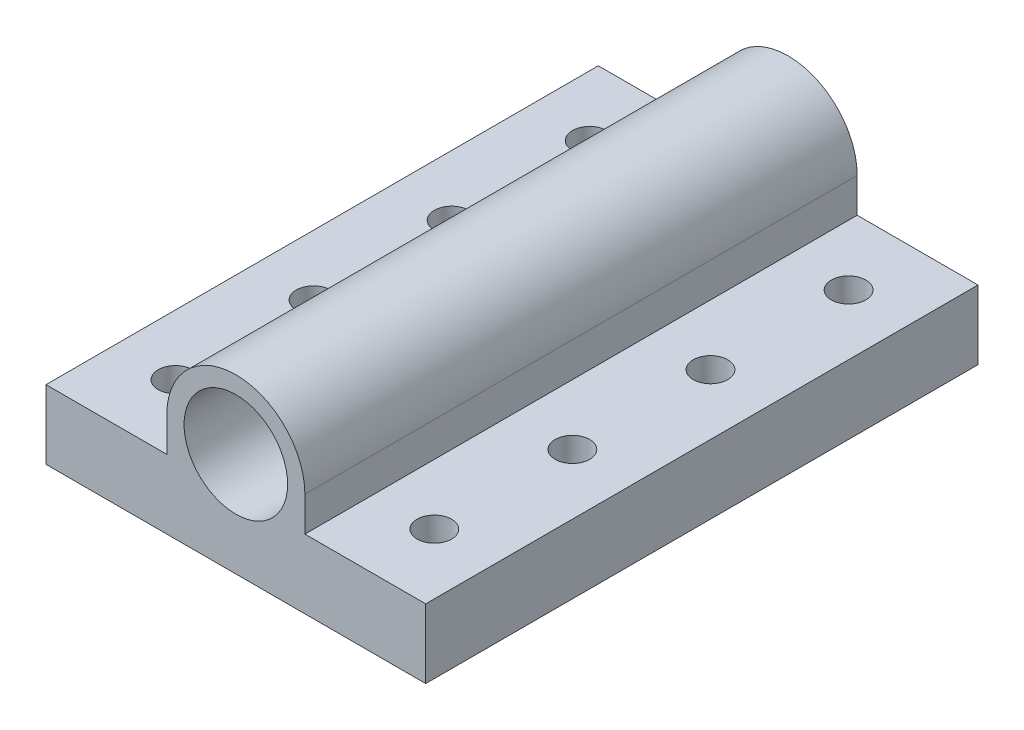
ISO-10303-21;
HEADER;
FILE_DESCRIPTION(('STEP AP214'),'2;1');
FILE_NAME('part.step','',(''),(''),'','','');
FILE_SCHEMA(('AUTOMOTIVE_DESIGN { 1 0 10303 214 1 1 1 1 }'));
ENDSEC;
DATA;
#1=APPLICATION_CONTEXT('core data for automotive mechanical design processes');
#2=APPLICATION_PROTOCOL_DEFINITION('international standard','automotive_design',2000,#1);
#3=PRODUCT_CONTEXT('',#1,'mechanical');
#4=PRODUCT('Part','Part','',(#3));
#5=PRODUCT_RELATED_PRODUCT_CATEGORY('part','',(#4));
#6=PRODUCT_DEFINITION_FORMATION('','',#4);
#7=PRODUCT_DEFINITION_CONTEXT('part definition',#1,'design');
#8=PRODUCT_DEFINITION('design','',#6,#7);
#9=PRODUCT_DEFINITION_SHAPE('','',#8);
#10=(LENGTH_UNIT() NAMED_UNIT(*) SI_UNIT(.MILLI.,.METRE.));
#11=(NAMED_UNIT(*) PLANE_ANGLE_UNIT() SI_UNIT($,.RADIAN.));
#12=(NAMED_UNIT(*) SI_UNIT($,.STERADIAN.) SOLID_ANGLE_UNIT());
#13=UNCERTAINTY_MEASURE_WITH_UNIT(LENGTH_MEASURE(1.E-05),#10,'distance_accuracy_value','');
#14=(GEOMETRIC_REPRESENTATION_CONTEXT(3) GLOBAL_UNCERTAINTY_ASSIGNED_CONTEXT((#13)) GLOBAL_UNIT_ASSIGNED_CONTEXT((#10,
#11,#12)) REPRESENTATION_CONTEXT('',''));
#15=CARTESIAN_POINT('',(0.,0.,0.));
#16=DIRECTION('',(0.,0.,1.));
#17=DIRECTION('',(1.,0.,0.));
#18=AXIS2_PLACEMENT_3D('',#15,#16,#17);
#19=CARTESIAN_POINT('',(-27.5,5.00000000000001,80.));
#20=DIRECTION('',(0.,0.,-1.));
#21=DIRECTION('',(-1.,0.,0.));
#22=AXIS2_PLACEMENT_3D('',#19,#20,#21);
#23=PLANE('',#22);
#24=DIRECTION('',(0.,1.,0.));
#25=VECTOR('',#24,1.);
#26=CARTESIAN_POINT('',(0.,0.,80.));
#27=LINE('',#26,#25);
#28=CARTESIAN_POINT('',(0.,-9.99999999999998,80.));
#29=VERTEX_POINT('',#28);
#30=CARTESIAN_POINT('',(0.,0.,80.));
#31=VERTEX_POINT('',#30);
#32=EDGE_CURVE('E147',#29,#31,#27,.T.);
#33=ORIENTED_EDGE('',*,*,#32,.T.);
#34=DIRECTION('',(-1.,0.,0.));
#35=VECTOR('',#34,1.);
#36=CARTESIAN_POINT('',(0.,0.,80.));
#37=LINE('',#36,#35);
#38=CARTESIAN_POINT('',(-17.5,0.,80.));
#39=VERTEX_POINT('',#38);
#40=EDGE_CURVE('E95',#31,#39,#37,.T.);
#41=ORIENTED_EDGE('',*,*,#40,.T.);
#42=DIRECTION('',(0.,1.,0.));
#43=VECTOR('',#42,1.);
#44=CARTESIAN_POINT('',(-17.5,0.,80.));
#45=LINE('',#44,#43);
#46=CARTESIAN_POINT('',(-17.5,5.00000000000001,80.));
#47=VERTEX_POINT('',#46);
#48=EDGE_CURVE('E195',#39,#47,#45,.T.);
#49=ORIENTED_EDGE('',*,*,#48,.T.);
#50=CARTESIAN_POINT('',(-27.5,5.00000000000001,80.));
#51=DIRECTION('',(0.,0.,1.));
#52=DIRECTION('',(-1.,0.,0.));
#53=AXIS2_PLACEMENT_3D('',#50,#51,#52);
#54=CIRCLE('',#53,10.);
#55=CARTESIAN_POINT('',(-37.5,5.00000000000001,80.));
#56=VERTEX_POINT('',#55);
#57=EDGE_CURVE('E197',#47,#56,#54,.T.);
#58=ORIENTED_EDGE('',*,*,#57,.T.);
#59=DIRECTION('',(0.,-1.,0.));
#60=VECTOR('',#59,1.);
#61=CARTESIAN_POINT('',(-37.5,0.,80.));
#62=LINE('',#61,#60);
#63=CARTESIAN_POINT('',(-37.5,0.,80.));
#64=VERTEX_POINT('',#63);
#65=EDGE_CURVE('E114',#56,#64,#62,.T.);
#66=ORIENTED_EDGE('',*,*,#65,.T.);
#67=DIRECTION('',(-1.,0.,0.));
#68=VECTOR('',#67,1.);
#69=CARTESIAN_POINT('',(-37.5,0.,80.));
#70=LINE('',#69,#68);
#71=CARTESIAN_POINT('',(-55.,0.,80.));
#72=VERTEX_POINT('',#71);
#73=EDGE_CURVE('E108',#64,#72,#70,.T.);
#74=ORIENTED_EDGE('',*,*,#73,.T.);
#75=DIRECTION('',(0.,-1.,0.));
#76=VECTOR('',#75,1.);
#77=CARTESIAN_POINT('',(-55.,0.,80.));
#78=LINE('',#77,#76);
#79=CARTESIAN_POINT('',(-55.,-10.,80.));
#80=VERTEX_POINT('',#79);
#81=EDGE_CURVE('E112',#72,#80,#78,.T.);
#82=ORIENTED_EDGE('',*,*,#81,.T.);
#83=DIRECTION('',(1.,0.,0.));
#84=VECTOR('',#83,1.);
#85=CARTESIAN_POINT('',(0.,-9.99999999999998,80.));
#86=LINE('',#85,#84);
#87=EDGE_CURVE('E52',#80,#29,#86,.T.);
#88=ORIENTED_EDGE('',*,*,#87,.T.);
#89=EDGE_LOOP('',(#33,#41,#49,#58,#66,#74,#82,#88));
#90=FACE_BOUND('',#89,.T.);
#91=CARTESIAN_POINT('',(-27.5,5.00000000000001,80.));
#92=DIRECTION('',(0.,0.,1.));
#93=DIRECTION('',(1.,0.,0.));
#94=AXIS2_PLACEMENT_3D('',#91,#92,#93);
#95=CIRCLE('',#94,7.5);
#96=CARTESIAN_POINT('',(-20.,5.00000000000001,80.));
#97=VERTEX_POINT('',#96);
#98=EDGE_CURVE('E136',#97,#97,#95,.T.);
#99=ORIENTED_EDGE('',*,*,#98,.F.);
#100=EDGE_LOOP('',(#99));
#101=FACE_BOUND('',#100,.T.);
#102=ADVANCED_FACE('F33',(#90,#101),#23,.F.);
#103=CARTESIAN_POINT('',(-27.5,5.00000000000001,0.));
#104=DIRECTION('',(0.,0.,-1.));
#105=DIRECTION('',(-1.,0.,0.));
#106=AXIS2_PLACEMENT_3D('',#103,#104,#105);
#107=PLANE('',#106);
#108=DIRECTION('',(0.,1.,0.));
#109=VECTOR('',#108,1.);
#110=CARTESIAN_POINT('',(0.,0.,0.));
#111=LINE('',#110,#109);
#112=CARTESIAN_POINT('',(0.,-9.99999999999998,0.));
#113=VERTEX_POINT('',#112);
#114=CARTESIAN_POINT('',(0.,0.,0.));
#115=VERTEX_POINT('',#114);
#116=EDGE_CURVE('E132',#113,#115,#111,.T.);
#117=ORIENTED_EDGE('',*,*,#116,.F.);
#118=DIRECTION('',(1.,0.,0.));
#119=VECTOR('',#118,1.);
#120=CARTESIAN_POINT('',(0.,-9.99999999999998,0.));
#121=LINE('',#120,#119);
#122=CARTESIAN_POINT('',(-55.,-10.,0.));
#123=VERTEX_POINT('',#122);
#124=EDGE_CURVE('E87',#123,#113,#121,.T.);
#125=ORIENTED_EDGE('',*,*,#124,.F.);
#126=DIRECTION('',(0.,-1.,0.));
#127=VECTOR('',#126,1.);
#128=CARTESIAN_POINT('',(-55.,0.,0.));
#129=LINE('',#128,#127);
#130=CARTESIAN_POINT('',(-55.,0.,0.));
#131=VERTEX_POINT('',#130);
#132=EDGE_CURVE('E81',#131,#123,#129,.T.);
#133=ORIENTED_EDGE('',*,*,#132,.F.);
#134=DIRECTION('',(-1.,0.,0.));
#135=VECTOR('',#134,1.);
#136=CARTESIAN_POINT('',(-37.5,0.,0.));
#137=LINE('',#136,#135);
#138=CARTESIAN_POINT('',(-37.5,0.,0.));
#139=VERTEX_POINT('',#138);
#140=EDGE_CURVE('E122',#139,#131,#137,.T.);
#141=ORIENTED_EDGE('',*,*,#140,.F.);
#142=DIRECTION('',(0.,-1.,0.));
#143=VECTOR('',#142,1.);
#144=CARTESIAN_POINT('',(-37.5,0.,0.));
#145=LINE('',#144,#143);
#146=CARTESIAN_POINT('',(-37.5,5.00000000000001,0.));
#147=VERTEX_POINT('',#146);
#148=EDGE_CURVE('E142',#147,#139,#145,.T.);
#149=ORIENTED_EDGE('',*,*,#148,.F.);
#150=CARTESIAN_POINT('',(-27.5,5.00000000000001,0.));
#151=DIRECTION('',(0.,0.,1.));
#152=DIRECTION('',(-1.,0.,0.));
#153=AXIS2_PLACEMENT_3D('',#150,#151,#152);
#154=CIRCLE('',#153,10.);
#155=CARTESIAN_POINT('',(-17.5,5.00000000000001,0.));
#156=VERTEX_POINT('',#155);
#157=EDGE_CURVE('E140',#156,#147,#154,.T.);
#158=ORIENTED_EDGE('',*,*,#157,.F.);
#159=DIRECTION('',(0.,1.,0.));
#160=VECTOR('',#159,1.);
#161=CARTESIAN_POINT('',(-17.5,0.,0.));
#162=LINE('',#161,#160);
#163=CARTESIAN_POINT('',(-17.5,0.,0.));
#164=VERTEX_POINT('',#163);
#165=EDGE_CURVE('E138',#164,#156,#162,.T.);
#166=ORIENTED_EDGE('',*,*,#165,.F.);
#167=DIRECTION('',(-1.,0.,0.));
#168=VECTOR('',#167,1.);
#169=CARTESIAN_POINT('',(0.,0.,0.));
#170=LINE('',#169,#168);
#171=EDGE_CURVE('E135',#115,#164,#170,.T.);
#172=ORIENTED_EDGE('',*,*,#171,.F.);
#173=EDGE_LOOP('',(#117,#125,#133,#141,#149,#158,#166,#172));
#174=FACE_BOUND('',#173,.T.);
#175=CARTESIAN_POINT('',(-27.5,5.00000000000001,0.));
#176=DIRECTION('',(0.,0.,1.));
#177=DIRECTION('',(1.,0.,0.));
#178=AXIS2_PLACEMENT_3D('',#175,#176,#177);
#179=CIRCLE('',#178,7.5);
#180=CARTESIAN_POINT('',(-20.,5.00000000000001,0.));
#181=VERTEX_POINT('',#180);
#182=EDGE_CURVE('E182',#181,#181,#179,.T.);
#183=ORIENTED_EDGE('',*,*,#182,.T.);
#184=EDGE_LOOP('',(#183));
#185=FACE_BOUND('',#184,.T.);
#186=ADVANCED_FACE('F210',(#174,#185),#107,.T.);
#187=CARTESIAN_POINT('',(0.,0.,80.));
#188=DIRECTION('',(-1.,0.,0.));
#189=DIRECTION('',(0.,0.,1.));
#190=AXIS2_PLACEMENT_3D('',#187,#188,#189);
#191=PLANE('',#190);
#192=ORIENTED_EDGE('',*,*,#116,.T.);
#193=DIRECTION('',(0.,0.,-1.));
#194=VECTOR('',#193,1.);
#195=CARTESIAN_POINT('',(0.,0.,80.));
#196=LINE('',#195,#194);
#197=EDGE_CURVE('E11',#31,#115,#196,.T.);
#198=ORIENTED_EDGE('',*,*,#197,.F.);
#199=ORIENTED_EDGE('',*,*,#32,.F.);
#200=DIRECTION('',(0.,0.,-1.));
#201=VECTOR('',#200,1.);
#202=CARTESIAN_POINT('',(0.,-9.99999999999998,80.));
#203=LINE('',#202,#201);
#204=EDGE_CURVE('E128',#29,#113,#203,.T.);
#205=ORIENTED_EDGE('',*,*,#204,.T.);
#206=EDGE_LOOP('',(#192,#198,#199,#205));
#207=FACE_BOUND('',#206,.T.);
#208=ADVANCED_FACE('F35',(#207),#191,.F.);
#209=CARTESIAN_POINT('',(0.,0.,80.));
#210=DIRECTION('',(0.,-1.,0.));
#211=DIRECTION('',(1.,0.,0.));
#212=AXIS2_PLACEMENT_3D('',#209,#210,#211);
#213=PLANE('',#212);
#214=CARTESIAN_POINT('',(-8.75000000000001,0.,30.));
#215=DIRECTION('',(0.,1.,0.));
#216=DIRECTION('',(0.,0.,1.));
#217=AXIS2_PLACEMENT_3D('',#214,#215,#216);
#218=CIRCLE('',#217,2.5);
#219=CARTESIAN_POINT('',(-8.75000000000001,0.,32.5));
#220=VERTEX_POINT('',#219);
#221=EDGE_CURVE('E294',#220,#220,#218,.T.);
#222=ORIENTED_EDGE('',*,*,#221,.F.);
#223=EDGE_LOOP('',(#222));
#224=FACE_BOUND('',#223,.T.);
#225=CARTESIAN_POINT('',(-8.75,0.,50.));
#226=DIRECTION('',(0.,1.,0.));
#227=DIRECTION('',(0.,0.,1.));
#228=AXIS2_PLACEMENT_3D('',#225,#226,#227);
#229=CIRCLE('',#228,2.5);
#230=CARTESIAN_POINT('',(-8.75,0.,52.5));
#231=VERTEX_POINT('',#230);
#232=EDGE_CURVE('E297',#231,#231,#229,.T.);
#233=ORIENTED_EDGE('',*,*,#232,.F.);
#234=EDGE_LOOP('',(#233));
#235=FACE_BOUND('',#234,.T.);
#236=CARTESIAN_POINT('',(-8.75,0.,70.));
#237=DIRECTION('',(0.,1.,0.));
#238=DIRECTION('',(0.,0.,1.));
#239=AXIS2_PLACEMENT_3D('',#236,#237,#238);
#240=CIRCLE('',#239,2.5);
#241=CARTESIAN_POINT('',(-8.75,0.,72.5));
#242=VERTEX_POINT('',#241);
#243=EDGE_CURVE('E286',#242,#242,#240,.T.);
#244=ORIENTED_EDGE('',*,*,#243,.F.);
#245=EDGE_LOOP('',(#244));
#246=FACE_BOUND('',#245,.T.);
#247=CARTESIAN_POINT('',(-8.75000000000001,0.,10.));
#248=DIRECTION('',(0.,1.,0.));
#249=DIRECTION('',(0.,0.,1.));
#250=AXIS2_PLACEMENT_3D('',#247,#248,#249);
#251=CIRCLE('',#250,2.5);
#252=CARTESIAN_POINT('',(-8.75000000000001,0.,12.5));
#253=VERTEX_POINT('',#252);
#254=EDGE_CURVE('E163',#253,#253,#251,.T.);
#255=ORIENTED_EDGE('',*,*,#254,.F.);
#256=EDGE_LOOP('',(#255));
#257=FACE_BOUND('',#256,.T.);
#258=ORIENTED_EDGE('',*,*,#171,.T.);
#259=DIRECTION('',(0.,0.,-1.));
#260=VECTOR('',#259,1.);
#261=CARTESIAN_POINT('',(-17.5,0.,80.));
#262=LINE('',#261,#260);
#263=EDGE_CURVE('E43',#39,#164,#262,.T.);
#264=ORIENTED_EDGE('',*,*,#263,.F.);
#265=ORIENTED_EDGE('',*,*,#40,.F.);
#266=ORIENTED_EDGE('',*,*,#197,.T.);
#267=EDGE_LOOP('',(#258,#264,#265,#266));
#268=FACE_BOUND('',#267,.T.);
#269=ADVANCED_FACE('F304',(#224,#235,#246,#257,#268),#213,.F.);
#270=CARTESIAN_POINT('',(-17.5,0.,80.));
#271=DIRECTION('',(-1.,0.,0.));
#272=DIRECTION('',(0.,-1.,0.));
#273=AXIS2_PLACEMENT_3D('',#270,#271,#272);
#274=PLANE('',#273);
#275=ORIENTED_EDGE('',*,*,#165,.T.);
#276=DIRECTION('',(0.,0.,-1.));
#277=VECTOR('',#276,1.);
#278=CARTESIAN_POINT('',(-17.5,5.00000000000001,80.));
#279=LINE('',#278,#277);
#280=EDGE_CURVE('E154',#47,#156,#279,.T.);
#281=ORIENTED_EDGE('',*,*,#280,.F.);
#282=ORIENTED_EDGE('',*,*,#48,.F.);
#283=ORIENTED_EDGE('',*,*,#263,.T.);
#284=EDGE_LOOP('',(#275,#281,#282,#283));
#285=FACE_BOUND('',#284,.T.);
#286=ADVANCED_FACE('F306',(#285),#274,.F.);
#287=CARTESIAN_POINT('',(-27.5,5.00000000000001,80.));
#288=DIRECTION('',(0.,0.,-1.));
#289=DIRECTION('',(-1.,0.,0.));
#290=AXIS2_PLACEMENT_3D('',#287,#288,#289);
#291=CYLINDRICAL_SURFACE('',#290,10.);
#292=ORIENTED_EDGE('',*,*,#157,.T.);
#293=DIRECTION('',(0.,0.,-1.));
#294=VECTOR('',#293,1.);
#295=CARTESIAN_POINT('',(-37.5,5.00000000000001,80.));
#296=LINE('',#295,#294);
#297=EDGE_CURVE('E151',#56,#147,#296,.T.);
#298=ORIENTED_EDGE('',*,*,#297,.F.);
#299=ORIENTED_EDGE('',*,*,#57,.F.);
#300=ORIENTED_EDGE('',*,*,#280,.T.);
#301=EDGE_LOOP('',(#292,#298,#299,#300));
#302=FACE_BOUND('',#301,.T.);
#303=ADVANCED_FACE('F203',(#302),#291,.T.);
#304=CARTESIAN_POINT('',(-37.5,0.,80.));
#305=DIRECTION('',(1.,0.,0.));
#306=DIRECTION('',(0.,0.,-1.));
#307=AXIS2_PLACEMENT_3D('',#304,#305,#306);
#308=PLANE('',#307);
#309=ORIENTED_EDGE('',*,*,#148,.T.);
#310=DIRECTION('',(0.,0.,-1.));
#311=VECTOR('',#310,1.);
#312=CARTESIAN_POINT('',(-37.5,0.,80.));
#313=LINE('',#312,#311);
#314=EDGE_CURVE('E123',#64,#139,#313,.T.);
#315=ORIENTED_EDGE('',*,*,#314,.F.);
#316=ORIENTED_EDGE('',*,*,#65,.F.);
#317=ORIENTED_EDGE('',*,*,#297,.T.);
#318=EDGE_LOOP('',(#309,#315,#316,#317));
#319=FACE_BOUND('',#318,.T.);
#320=ADVANCED_FACE('F207',(#319),#308,.F.);
#321=CARTESIAN_POINT('',(-37.5,0.,80.));
#322=DIRECTION('',(0.,-1.,0.));
#323=DIRECTION('',(1.,0.,0.));
#324=AXIS2_PLACEMENT_3D('',#321,#322,#323);
#325=PLANE('',#324);
#326=CARTESIAN_POINT('',(-46.25,0.,70.));
#327=DIRECTION('',(0.,1.,0.));
#328=DIRECTION('',(0.,0.,-1.));
#329=AXIS2_PLACEMENT_3D('',#326,#327,#328);
#330=CIRCLE('',#329,2.5);
#331=CARTESIAN_POINT('',(-46.25,0.,67.5));
#332=VERTEX_POINT('',#331);
#333=EDGE_CURVE('E282',#332,#332,#330,.T.);
#334=ORIENTED_EDGE('',*,*,#333,.F.);
#335=EDGE_LOOP('',(#334));
#336=FACE_BOUND('',#335,.T.);
#337=CARTESIAN_POINT('',(-46.25,0.,50.));
#338=DIRECTION('',(0.,1.,0.));
#339=DIRECTION('',(0.,0.,-1.));
#340=AXIS2_PLACEMENT_3D('',#337,#338,#339);
#341=CIRCLE('',#340,2.50000000000001);
#342=CARTESIAN_POINT('',(-46.25,0.,47.5));
#343=VERTEX_POINT('',#342);
#344=EDGE_CURVE('E269',#343,#343,#341,.T.);
#345=ORIENTED_EDGE('',*,*,#344,.F.);
#346=EDGE_LOOP('',(#345));
#347=FACE_BOUND('',#346,.T.);
#348=CARTESIAN_POINT('',(-46.25,0.,30.));
#349=DIRECTION('',(0.,1.,0.));
#350=DIRECTION('',(0.,0.,-1.));
#351=AXIS2_PLACEMENT_3D('',#348,#349,#350);
#352=CIRCLE('',#351,2.49999999999999);
#353=CARTESIAN_POINT('',(-46.25,0.,27.5));
#354=VERTEX_POINT('',#353);
#355=EDGE_CURVE('E283',#354,#354,#352,.T.);
#356=ORIENTED_EDGE('',*,*,#355,.F.);
#357=EDGE_LOOP('',(#356));
#358=FACE_BOUND('',#357,.T.);
#359=CARTESIAN_POINT('',(-46.25,0.,10.));
#360=DIRECTION('',(0.,1.,0.));
#361=DIRECTION('',(0.,0.,-1.));
#362=AXIS2_PLACEMENT_3D('',#359,#360,#361);
#363=CIRCLE('',#362,2.5);
#364=CARTESIAN_POINT('',(-46.25,0.,7.50000000000001));
#365=VERTEX_POINT('',#364);
#366=EDGE_CURVE('E289',#365,#365,#363,.T.);
#367=ORIENTED_EDGE('',*,*,#366,.F.);
#368=EDGE_LOOP('',(#367));
#369=FACE_BOUND('',#368,.T.);
#370=ORIENTED_EDGE('',*,*,#140,.T.);
#371=DIRECTION('',(0.,0.,-1.));
#372=VECTOR('',#371,1.);
#373=CARTESIAN_POINT('',(-55.,0.,80.));
#374=LINE('',#373,#372);
#375=EDGE_CURVE('E119',#72,#131,#374,.T.);
#376=ORIENTED_EDGE('',*,*,#375,.F.);
#377=ORIENTED_EDGE('',*,*,#73,.F.);
#378=ORIENTED_EDGE('',*,*,#314,.T.);
#379=EDGE_LOOP('',(#370,#376,#377,#378));
#380=FACE_BOUND('',#379,.T.);
#381=ADVANCED_FACE('F120',(#336,#347,#358,#369,#380),#325,.F.);
#382=CARTESIAN_POINT('',(-55.,0.,80.));
#383=DIRECTION('',(1.,0.,0.));
#384=DIRECTION('',(0.,0.,-1.));
#385=AXIS2_PLACEMENT_3D('',#382,#383,#384);
#386=PLANE('',#385);
#387=ORIENTED_EDGE('',*,*,#132,.T.);
#388=DIRECTION('',(0.,0.,-1.));
#389=VECTOR('',#388,1.);
#390=CARTESIAN_POINT('',(-55.,-10.,80.));
#391=LINE('',#390,#389);
#392=EDGE_CURVE('E124',#80,#123,#391,.T.);
#393=ORIENTED_EDGE('',*,*,#392,.F.);
#394=ORIENTED_EDGE('',*,*,#81,.F.);
#395=ORIENTED_EDGE('',*,*,#375,.T.);
#396=EDGE_LOOP('',(#387,#393,#394,#395));
#397=FACE_BOUND('',#396,.T.);
#398=ADVANCED_FACE('F126',(#397),#386,.F.);
#399=CARTESIAN_POINT('',(0.,-9.99999999999998,80.));
#400=DIRECTION('',(0.,1.,0.));
#401=DIRECTION('',(-1.,0.,0.));
#402=AXIS2_PLACEMENT_3D('',#399,#400,#401);
#403=PLANE('',#402);
#404=CARTESIAN_POINT('',(-8.75000000000001,-10.,30.));
#405=DIRECTION('',(0.,1.,0.));
#406=DIRECTION('',(-1.,0.,0.));
#407=AXIS2_PLACEMENT_3D('',#404,#405,#406);
#408=CIRCLE('',#407,2.5);
#409=CARTESIAN_POINT('',(-11.25,-10.,30.));
#410=VERTEX_POINT('',#409);
#411=EDGE_CURVE('E37',#410,#410,#408,.T.);
#412=ORIENTED_EDGE('',*,*,#411,.T.);
#413=EDGE_LOOP('',(#412));
#414=FACE_BOUND('',#413,.T.);
#415=CARTESIAN_POINT('',(-8.75,-10.,50.));
#416=DIRECTION('',(0.,1.,0.));
#417=DIRECTION('',(-1.,0.,0.));
#418=AXIS2_PLACEMENT_3D('',#415,#416,#417);
#419=CIRCLE('',#418,2.5);
#420=CARTESIAN_POINT('',(-11.25,-10.,50.));
#421=VERTEX_POINT('',#420);
#422=EDGE_CURVE('E177',#421,#421,#419,.T.);
#423=ORIENTED_EDGE('',*,*,#422,.T.);
#424=EDGE_LOOP('',(#423));
#425=FACE_BOUND('',#424,.T.);
#426=CARTESIAN_POINT('',(-8.75,-10.,70.));
#427=DIRECTION('',(0.,1.,0.));
#428=DIRECTION('',(-1.,0.,0.));
#429=AXIS2_PLACEMENT_3D('',#426,#427,#428);
#430=CIRCLE('',#429,2.5);
#431=CARTESIAN_POINT('',(-11.25,-10.,70.));
#432=VERTEX_POINT('',#431);
#433=EDGE_CURVE('E175',#432,#432,#430,.T.);
#434=ORIENTED_EDGE('',*,*,#433,.T.);
#435=EDGE_LOOP('',(#434));
#436=FACE_BOUND('',#435,.T.);
#437=CARTESIAN_POINT('',(-46.25,-10.,70.));
#438=DIRECTION('',(0.,1.,0.));
#439=DIRECTION('',(-1.,0.,0.));
#440=AXIS2_PLACEMENT_3D('',#437,#438,#439);
#441=CIRCLE('',#440,2.5);
#442=CARTESIAN_POINT('',(-48.75,-10.,70.));
#443=VERTEX_POINT('',#442);
#444=EDGE_CURVE('E172',#443,#443,#441,.T.);
#445=ORIENTED_EDGE('',*,*,#444,.T.);
#446=EDGE_LOOP('',(#445));
#447=FACE_BOUND('',#446,.T.);
#448=CARTESIAN_POINT('',(-46.25,-10.,50.));
#449=DIRECTION('',(0.,1.,0.));
#450=DIRECTION('',(-1.,0.,0.));
#451=AXIS2_PLACEMENT_3D('',#448,#449,#450);
#452=CIRCLE('',#451,2.50000000000001);
#453=CARTESIAN_POINT('',(-48.75,-10.,50.));
#454=VERTEX_POINT('',#453);
#455=EDGE_CURVE('E169',#454,#454,#452,.T.);
#456=ORIENTED_EDGE('',*,*,#455,.T.);
#457=EDGE_LOOP('',(#456));
#458=FACE_BOUND('',#457,.T.);
#459=CARTESIAN_POINT('',(-46.25,-10.,30.));
#460=DIRECTION('',(0.,1.,0.));
#461=DIRECTION('',(-1.,0.,0.));
#462=AXIS2_PLACEMENT_3D('',#459,#460,#461);
#463=CIRCLE('',#462,2.49999999999999);
#464=CARTESIAN_POINT('',(-48.75,-10.,30.));
#465=VERTEX_POINT('',#464);
#466=EDGE_CURVE('E166',#465,#465,#463,.T.);
#467=ORIENTED_EDGE('',*,*,#466,.T.);
#468=EDGE_LOOP('',(#467));
#469=FACE_BOUND('',#468,.T.);
#470=CARTESIAN_POINT('',(-46.25,-10.,10.));
#471=DIRECTION('',(0.,1.,0.));
#472=DIRECTION('',(-1.,0.,0.));
#473=AXIS2_PLACEMENT_3D('',#470,#471,#472);
#474=CIRCLE('',#473,2.5);
#475=CARTESIAN_POINT('',(-48.75,-10.,10.));
#476=VERTEX_POINT('',#475);
#477=EDGE_CURVE('E162',#476,#476,#474,.T.);
#478=ORIENTED_EDGE('',*,*,#477,.T.);
#479=EDGE_LOOP('',(#478));
#480=FACE_BOUND('',#479,.T.);
#481=CARTESIAN_POINT('',(-8.75000000000001,-10.,10.));
#482=DIRECTION('',(0.,1.,0.));
#483=DIRECTION('',(-1.,0.,0.));
#484=AXIS2_PLACEMENT_3D('',#481,#482,#483);
#485=CIRCLE('',#484,2.5);
#486=CARTESIAN_POINT('',(-11.25,-10.,10.));
#487=VERTEX_POINT('',#486);
#488=EDGE_CURVE('E159',#487,#487,#485,.T.);
#489=ORIENTED_EDGE('',*,*,#488,.T.);
#490=EDGE_LOOP('',(#489));
#491=FACE_BOUND('',#490,.T.);
#492=ORIENTED_EDGE('',*,*,#124,.T.);
#493=ORIENTED_EDGE('',*,*,#204,.F.);
#494=ORIENTED_EDGE('',*,*,#87,.F.);
#495=ORIENTED_EDGE('',*,*,#392,.T.);
#496=EDGE_LOOP('',(#492,#493,#494,#495));
#497=FACE_BOUND('',#496,.T.);
#498=ADVANCED_FACE('F215',(#414,#425,#436,#447,#458,#469,#480,#491,#497),#403,.F.);
#499=CARTESIAN_POINT('',(-27.5,5.00000000000001,80.));
#500=DIRECTION('',(0.,0.,-1.));
#501=DIRECTION('',(-1.,0.,0.));
#502=AXIS2_PLACEMENT_3D('',#499,#500,#501);
#503=CYLINDRICAL_SURFACE('',#502,7.5);
#504=ORIENTED_EDGE('',*,*,#98,.T.);
#505=EDGE_LOOP('',(#504));
#506=FACE_BOUND('',#505,.T.);
#507=ORIENTED_EDGE('',*,*,#182,.F.);
#508=EDGE_LOOP('',(#507));
#509=FACE_BOUND('',#508,.T.);
#510=ADVANCED_FACE('F217',(#506,#509),#503,.F.);
#511=CARTESIAN_POINT('',(-8.75000000000001,-2000.,10.));
#512=DIRECTION('',(0.,1.,0.));
#513=DIRECTION('',(0.,0.,1.));
#514=AXIS2_PLACEMENT_3D('',#511,#512,#513);
#515=CYLINDRICAL_SURFACE('',#514,2.5);
#516=ORIENTED_EDGE('',*,*,#254,.T.);
#517=EDGE_LOOP('',(#516));
#518=FACE_BOUND('',#517,.T.);
#519=ORIENTED_EDGE('',*,*,#488,.F.);
#520=EDGE_LOOP('',(#519));
#521=FACE_BOUND('',#520,.T.);
#522=ADVANCED_FACE('F223',(#518,#521),#515,.F.);
#523=CARTESIAN_POINT('',(-46.25,-2000.,10.));
#524=DIRECTION('',(0.,1.,0.));
#525=DIRECTION('',(0.,0.,1.));
#526=AXIS2_PLACEMENT_3D('',#523,#524,#525);
#527=CYLINDRICAL_SURFACE('',#526,2.5);
#528=ORIENTED_EDGE('',*,*,#366,.T.);
#529=EDGE_LOOP('',(#528));
#530=FACE_BOUND('',#529,.T.);
#531=ORIENTED_EDGE('',*,*,#477,.F.);
#532=EDGE_LOOP('',(#531));
#533=FACE_BOUND('',#532,.T.);
#534=ADVANCED_FACE('F236',(#530,#533),#527,.F.);
#535=CARTESIAN_POINT('',(-46.25,-2000.,30.));
#536=DIRECTION('',(0.,1.,0.));
#537=DIRECTION('',(0.,0.,1.));
#538=AXIS2_PLACEMENT_3D('',#535,#536,#537);
#539=CYLINDRICAL_SURFACE('',#538,2.49999999999999);
#540=ORIENTED_EDGE('',*,*,#355,.T.);
#541=EDGE_LOOP('',(#540));
#542=FACE_BOUND('',#541,.T.);
#543=ORIENTED_EDGE('',*,*,#466,.F.);
#544=EDGE_LOOP('',(#543));
#545=FACE_BOUND('',#544,.T.);
#546=ADVANCED_FACE('F257',(#542,#545),#539,.F.);
#547=CARTESIAN_POINT('',(-46.25,-2000.,50.));
#548=DIRECTION('',(0.,1.,0.));
#549=DIRECTION('',(0.,0.,1.));
#550=AXIS2_PLACEMENT_3D('',#547,#548,#549);
#551=CYLINDRICAL_SURFACE('',#550,2.50000000000001);
#552=ORIENTED_EDGE('',*,*,#344,.T.);
#553=EDGE_LOOP('',(#552));
#554=FACE_BOUND('',#553,.T.);
#555=ORIENTED_EDGE('',*,*,#455,.F.);
#556=EDGE_LOOP('',(#555));
#557=FACE_BOUND('',#556,.T.);
#558=ADVANCED_FACE('F242',(#554,#557),#551,.F.);
#559=CARTESIAN_POINT('',(-46.25,-2000.,70.));
#560=DIRECTION('',(0.,1.,0.));
#561=DIRECTION('',(0.,0.,1.));
#562=AXIS2_PLACEMENT_3D('',#559,#560,#561);
#563=CYLINDRICAL_SURFACE('',#562,2.5);
#564=ORIENTED_EDGE('',*,*,#333,.T.);
#565=EDGE_LOOP('',(#564));
#566=FACE_BOUND('',#565,.T.);
#567=ORIENTED_EDGE('',*,*,#444,.F.);
#568=EDGE_LOOP('',(#567));
#569=FACE_BOUND('',#568,.T.);
#570=ADVANCED_FACE('F238',(#566,#569),#563,.F.);
#571=CARTESIAN_POINT('',(-8.75,-2000.,70.));
#572=DIRECTION('',(0.,1.,0.));
#573=DIRECTION('',(0.,0.,1.));
#574=AXIS2_PLACEMENT_3D('',#571,#572,#573);
#575=CYLINDRICAL_SURFACE('',#574,2.5);
#576=ORIENTED_EDGE('',*,*,#243,.T.);
#577=EDGE_LOOP('',(#576));
#578=FACE_BOUND('',#577,.T.);
#579=ORIENTED_EDGE('',*,*,#433,.F.);
#580=EDGE_LOOP('',(#579));
#581=FACE_BOUND('',#580,.T.);
#582=ADVANCED_FACE('F241',(#578,#581),#575,.F.);
#583=CARTESIAN_POINT('',(-8.75,-2000.,50.));
#584=DIRECTION('',(0.,1.,0.));
#585=DIRECTION('',(0.,0.,1.));
#586=AXIS2_PLACEMENT_3D('',#583,#584,#585);
#587=CYLINDRICAL_SURFACE('',#586,2.5);
#588=ORIENTED_EDGE('',*,*,#232,.T.);
#589=EDGE_LOOP('',(#588));
#590=FACE_BOUND('',#589,.T.);
#591=ORIENTED_EDGE('',*,*,#422,.F.);
#592=EDGE_LOOP('',(#591));
#593=FACE_BOUND('',#592,.T.);
#594=ADVANCED_FACE('F246',(#590,#593),#587,.F.);
#595=CARTESIAN_POINT('',(-8.75000000000001,-2000.,30.));
#596=DIRECTION('',(0.,1.,0.));
#597=DIRECTION('',(0.,0.,1.));
#598=AXIS2_PLACEMENT_3D('',#595,#596,#597);
#599=CYLINDRICAL_SURFACE('',#598,2.5);
#600=ORIENTED_EDGE('',*,*,#221,.T.);
#601=EDGE_LOOP('',(#600));
#602=FACE_BOUND('',#601,.T.);
#603=ORIENTED_EDGE('',*,*,#411,.F.);
#604=EDGE_LOOP('',(#603));
#605=FACE_BOUND('',#604,.T.);
#606=ADVANCED_FACE('F250',(#602,#605),#599,.F.);
#607=CLOSED_SHELL('',(#102,#186,#208,#269,#286,#303,#320,#381,#398,#498,#510,#522,#534,#546,
#558,#570,#582,#594,#606));
#608=MANIFOLD_SOLID_BREP('B2',#607);
#609=ADVANCED_BREP_SHAPE_REPRESENTATION('',(#18,#608),#14);
#610=SHAPE_DEFINITION_REPRESENTATION(#9,#609);
ENDSEC;
END-ISO-10303-21;
